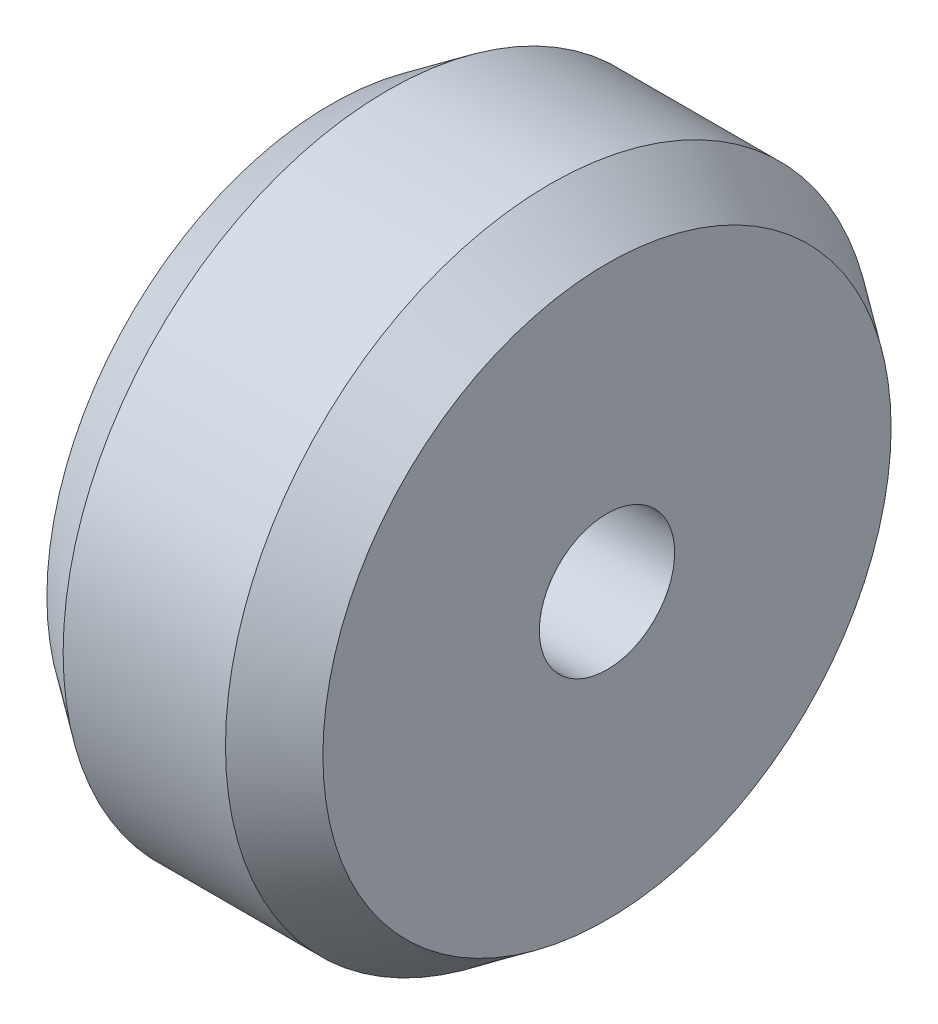
ISO-10303-21;
HEADER;
FILE_DESCRIPTION(('STEP AP214'),'2;1');
FILE_NAME('part.step','',(''),(''),'','','');
FILE_SCHEMA(('AUTOMOTIVE_DESIGN { 1 0 10303 214 1 1 1 1 }'));
ENDSEC;
DATA;
#1=APPLICATION_CONTEXT('core data for automotive mechanical design processes');
#2=APPLICATION_PROTOCOL_DEFINITION('international standard','automotive_design',2000,#1);
#3=PRODUCT_CONTEXT('',#1,'mechanical');
#4=PRODUCT('Part','Part','',(#3));
#5=PRODUCT_RELATED_PRODUCT_CATEGORY('part','',(#4));
#6=PRODUCT_DEFINITION_FORMATION('','',#4);
#7=PRODUCT_DEFINITION_CONTEXT('part definition',#1,'design');
#8=PRODUCT_DEFINITION('design','',#6,#7);
#9=PRODUCT_DEFINITION_SHAPE('','',#8);
#10=(LENGTH_UNIT() NAMED_UNIT(*) SI_UNIT(.MILLI.,.METRE.));
#11=(NAMED_UNIT(*) PLANE_ANGLE_UNIT() SI_UNIT($,.RADIAN.));
#12=(NAMED_UNIT(*) SI_UNIT($,.STERADIAN.) SOLID_ANGLE_UNIT());
#13=UNCERTAINTY_MEASURE_WITH_UNIT(LENGTH_MEASURE(1.E-05),#10,'distance_accuracy_value','');
#14=(GEOMETRIC_REPRESENTATION_CONTEXT(3) GLOBAL_UNCERTAINTY_ASSIGNED_CONTEXT((#13)) GLOBAL_UNIT_ASSIGNED_CONTEXT((#10,
#11,#12)) REPRESENTATION_CONTEXT('',''));
#15=CARTESIAN_POINT('',(0.,0.,0.));
#16=DIRECTION('',(0.,0.,1.));
#17=DIRECTION('',(1.,0.,0.));
#18=AXIS2_PLACEMENT_3D('',#15,#16,#17);
#19=CARTESIAN_POINT('',(-5.1,2.5,0.));
#20=DIRECTION('',(1.,0.,0.));
#21=DIRECTION('',(0.,0.,-1.));
#22=AXIS2_PLACEMENT_3D('',#19,#20,#21);
#23=PLANE('',#22);
#24=CARTESIAN_POINT('',(-5.1,0.,0.));
#25=DIRECTION('',(-1.,0.,0.));
#26=DIRECTION('',(0.,0.,1.));
#27=AXIS2_PLACEMENT_3D('',#24,#25,#26);
#28=CIRCLE('',#27,2.5);
#29=CARTESIAN_POINT('',(-5.1,0.,2.5));
#30=VERTEX_POINT('',#29);
#31=EDGE_CURVE('E64',#30,#30,#28,.T.);
#32=ORIENTED_EDGE('',*,*,#31,.F.);
#33=EDGE_LOOP('',(#32));
#34=FACE_BOUND('',#33,.T.);
#35=CARTESIAN_POINT('',(-5.1,0.,0.));
#36=DIRECTION('',(-1.,0.,0.));
#37=DIRECTION('',(0.,0.,1.));
#38=AXIS2_PLACEMENT_3D('',#35,#36,#37);
#39=CIRCLE('',#38,10.5);
#40=CARTESIAN_POINT('',(-5.1,0.,10.5));
#41=VERTEX_POINT('',#40);
#42=EDGE_CURVE('E10',#41,#41,#39,.T.);
#43=ORIENTED_EDGE('',*,*,#42,.T.);
#44=EDGE_LOOP('',(#43));
#45=FACE_BOUND('',#44,.T.);
#46=ADVANCED_FACE('F37',(#34,#45),#23,.F.);
#47=CARTESIAN_POINT('',(-3.,0.,0.));
#48=DIRECTION('',(1.,0.,0.));
#49=DIRECTION('',(0.,0.,-1.));
#50=AXIS2_PLACEMENT_3D('',#47,#48,#49);
#51=CONICAL_SURFACE('',#50,12.,0.620249485982821);
#52=ORIENTED_EDGE('',*,*,#42,.F.);
#53=EDGE_LOOP('',(#52));
#54=FACE_BOUND('',#53,.T.);
#55=CARTESIAN_POINT('',(-3.,0.,0.));
#56=DIRECTION('',(-1.,0.,0.));
#57=DIRECTION('',(0.,0.,1.));
#58=AXIS2_PLACEMENT_3D('',#55,#56,#57);
#59=CIRCLE('',#58,12.);
#60=CARTESIAN_POINT('',(-3.,0.,12.));
#61=VERTEX_POINT('',#60);
#62=EDGE_CURVE('E44',#61,#61,#59,.T.);
#63=ORIENTED_EDGE('',*,*,#62,.T.);
#64=EDGE_LOOP('',(#63));
#65=FACE_BOUND('',#64,.T.);
#66=ADVANCED_FACE('F72',(#54,#65),#51,.T.);
#67=CARTESIAN_POINT('',(-46.2094294419001,0.,0.));
#68=DIRECTION('',(-1.,0.,0.));
#69=DIRECTION('',(0.,0.,1.));
#70=AXIS2_PLACEMENT_3D('',#67,#68,#69);
#71=CYLINDRICAL_SURFACE('',#70,12.);
#72=ORIENTED_EDGE('',*,*,#62,.F.);
#73=EDGE_LOOP('',(#72));
#74=FACE_BOUND('',#73,.T.);
#75=CARTESIAN_POINT('',(2.99999999999992,0.,0.));
#76=DIRECTION('',(-1.,0.,0.));
#77=DIRECTION('',(0.,0.,1.));
#78=AXIS2_PLACEMENT_3D('',#75,#76,#77);
#79=CIRCLE('',#78,12.);
#80=CARTESIAN_POINT('',(2.99999999999992,0.,12.));
#81=VERTEX_POINT('',#80);
#82=EDGE_CURVE('E49',#81,#81,#79,.T.);
#83=ORIENTED_EDGE('',*,*,#82,.T.);
#84=EDGE_LOOP('',(#83));
#85=FACE_BOUND('',#84,.T.);
#86=ADVANCED_FACE('F76',(#74,#85),#71,.T.);
#87=CARTESIAN_POINT('',(5.09999999999992,0.,0.));
#88=DIRECTION('',(-1.,0.,0.));
#89=DIRECTION('',(0.,0.,1.));
#90=AXIS2_PLACEMENT_3D('',#87,#88,#89);
#91=CONICAL_SURFACE('',#90,10.5,0.620249485982815);
#92=ORIENTED_EDGE('',*,*,#82,.F.);
#93=EDGE_LOOP('',(#92));
#94=FACE_BOUND('',#93,.T.);
#95=CARTESIAN_POINT('',(5.09999999999992,0.,0.));
#96=DIRECTION('',(-1.,0.,0.));
#97=DIRECTION('',(0.,0.,1.));
#98=AXIS2_PLACEMENT_3D('',#95,#96,#97);
#99=CIRCLE('',#98,10.5);
#100=CARTESIAN_POINT('',(5.09999999999992,0.,10.5));
#101=VERTEX_POINT('',#100);
#102=EDGE_CURVE('E54',#101,#101,#99,.T.);
#103=ORIENTED_EDGE('',*,*,#102,.T.);
#104=EDGE_LOOP('',(#103));
#105=FACE_BOUND('',#104,.T.);
#106=ADVANCED_FACE('F81',(#94,#105),#91,.T.);
#107=CARTESIAN_POINT('',(5.09999999999996,2.5,0.));
#108=DIRECTION('',(-1.,0.,0.));
#109=DIRECTION('',(0.,0.,1.));
#110=AXIS2_PLACEMENT_3D('',#107,#108,#109);
#111=PLANE('',#110);
#112=ORIENTED_EDGE('',*,*,#102,.F.);
#113=EDGE_LOOP('',(#112));
#114=FACE_BOUND('',#113,.T.);
#115=CARTESIAN_POINT('',(5.1,0.,0.));
#116=DIRECTION('',(-1.,0.,0.));
#117=DIRECTION('',(0.,0.,1.));
#118=AXIS2_PLACEMENT_3D('',#115,#116,#117);
#119=CIRCLE('',#118,2.5);
#120=CARTESIAN_POINT('',(5.1,0.,2.5));
#121=VERTEX_POINT('',#120);
#122=EDGE_CURVE('E60',#121,#121,#119,.T.);
#123=ORIENTED_EDGE('',*,*,#122,.T.);
#124=EDGE_LOOP('',(#123));
#125=FACE_BOUND('',#124,.T.);
#126=ADVANCED_FACE('F87',(#114,#125),#111,.F.);
#127=CARTESIAN_POINT('',(-46.2094294419001,0.,0.));
#128=DIRECTION('',(-1.,0.,0.));
#129=DIRECTION('',(0.,0.,1.));
#130=AXIS2_PLACEMENT_3D('',#127,#128,#129);
#131=CYLINDRICAL_SURFACE('',#130,2.5);
#132=ORIENTED_EDGE('',*,*,#122,.F.);
#133=EDGE_LOOP('',(#132));
#134=FACE_BOUND('',#133,.T.);
#135=ORIENTED_EDGE('',*,*,#31,.T.);
#136=EDGE_LOOP('',(#135));
#137=FACE_BOUND('',#136,.T.);
#138=ADVANCED_FACE('F69',(#134,#137),#131,.F.);
#139=CLOSED_SHELL('',(#46,#66,#86,#106,#126,#138));
#140=MANIFOLD_SOLID_BREP('B2',#139);
#141=ADVANCED_BREP_SHAPE_REPRESENTATION('',(#18,#140),#14);
#142=SHAPE_DEFINITION_REPRESENTATION(#9,#141);
ENDSEC;
END-ISO-10303-21;
